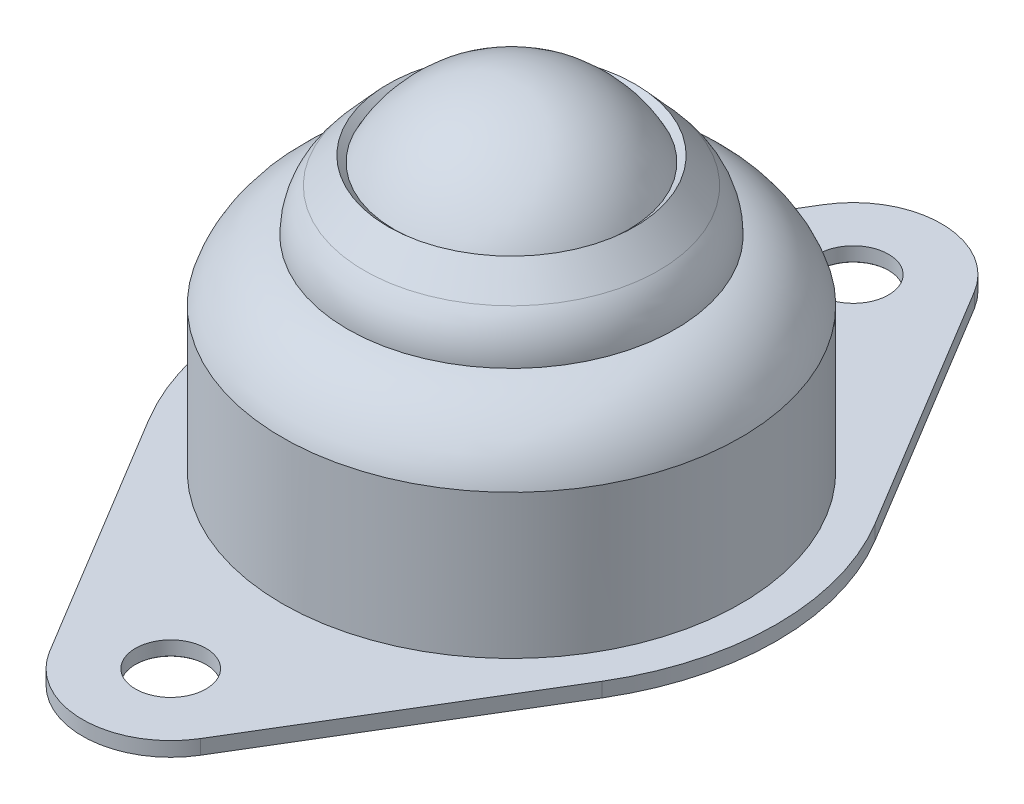
ISO-10303-21;
HEADER;
FILE_DESCRIPTION(('STEP AP214'),'2;1');
FILE_NAME('part.step','',(''),(''),'','','');
FILE_SCHEMA(('AUTOMOTIVE_DESIGN { 1 0 10303 214 1 1 1 1 }'));
ENDSEC;
DATA;
#1=APPLICATION_CONTEXT('core data for automotive mechanical design processes');
#2=APPLICATION_PROTOCOL_DEFINITION('international standard','automotive_design',2000,#1);
#3=PRODUCT_CONTEXT('',#1,'mechanical');
#4=PRODUCT('Part','Part','',(#3));
#5=PRODUCT_RELATED_PRODUCT_CATEGORY('part','',(#4));
#6=PRODUCT_DEFINITION_FORMATION('','',#4);
#7=PRODUCT_DEFINITION_CONTEXT('part definition',#1,'design');
#8=PRODUCT_DEFINITION('design','',#6,#7);
#9=PRODUCT_DEFINITION_SHAPE('','',#8);
#10=(LENGTH_UNIT() NAMED_UNIT(*) SI_UNIT(.MILLI.,.METRE.));
#11=(NAMED_UNIT(*) PLANE_ANGLE_UNIT() SI_UNIT($,.RADIAN.));
#12=(NAMED_UNIT(*) SI_UNIT($,.STERADIAN.) SOLID_ANGLE_UNIT());
#13=UNCERTAINTY_MEASURE_WITH_UNIT(LENGTH_MEASURE(1.E-05),#10,'distance_accuracy_value','');
#14=(GEOMETRIC_REPRESENTATION_CONTEXT(3) GLOBAL_UNCERTAINTY_ASSIGNED_CONTEXT((#13)) GLOBAL_UNIT_ASSIGNED_CONTEXT((#10,
#11,#12)) REPRESENTATION_CONTEXT('',''));
#15=CARTESIAN_POINT('',(0.,0.,0.));
#16=DIRECTION('',(0.,0.,1.));
#17=DIRECTION('',(1.,0.,0.));
#18=AXIS2_PLACEMENT_3D('',#15,#16,#17);
#19=CARTESIAN_POINT('',(0.,12.5,0.));
#20=DIRECTION('',(0.,-1.,0.));
#21=DIRECTION('',(0.,0.,1.));
#22=AXIS2_PLACEMENT_3D('',#19,#20,#21);
#23=SPHERICAL_SURFACE('',#22,7.5);
#24=CARTESIAN_POINT('',(0.,5.,0.));
#25=VERTEX_POINT('',#24);
#26=VERTEX_LOOP('',#25);
#27=FACE_BOUND('',#26,.T.);
#28=ADVANCED_FACE('F44',(#27),#23,.T.);
#29=CLOSED_SHELL('',(#28));
#30=MANIFOLD_SOLID_BREP('B2',#29);
#31=CARTESIAN_POINT('',(0.0289951469684916,0.,-19.35));
#32=DIRECTION('',(0.,1.,0.));
#33=DIRECTION('',(0.,0.,1.));
#34=AXIS2_PLACEMENT_3D('',#31,#32,#33);
#35=PLANE('',#34);
#36=CARTESIAN_POINT('',(0.0289951469684916,0.,-19.35));
#37=DIRECTION('',(0.,-1.,0.));
#38=DIRECTION('',(0.,0.,-1.));
#39=AXIS2_PLACEMENT_3D('',#36,#37,#38);
#40=CIRCLE('',#39,2.025);
#41=CARTESIAN_POINT('',(0.0289951469684916,0.,-21.375));
#42=VERTEX_POINT('',#41);
#43=EDGE_CURVE('E215',#42,#42,#40,.T.);
#44=ORIENTED_EDGE('',*,*,#43,.F.);
#45=EDGE_LOOP('',(#44));
#46=FACE_BOUND('',#45,.T.);
#47=CARTESIAN_POINT('',(0.0289951469684916,0.,-19.35));
#48=DIRECTION('',(0.,1.,0.));
#49=DIRECTION('',(0.,0.,1.));
#50=AXIS2_PLACEMENT_3D('',#47,#48,#49);
#51=CIRCLE('',#50,5.);
#52=CARTESIAN_POINT('',(4.30953843393734,0.,-21.9339793281654));
#53=VERTEX_POINT('',#52);
#54=CARTESIAN_POINT('',(-4.25154814000035,0.,-21.9339793281654));
#55=VERTEX_POINT('',#54);
#56=EDGE_CURVE('E156',#53,#55,#51,.T.);
#57=ORIENTED_EDGE('',*,*,#56,.F.);
#58=DIRECTION('',(-0.516795865633075,0.,-0.856108657393769));
#59=VECTOR('',#58,1.);
#60=CARTESIAN_POINT('',(4.30953843393734,0.,-21.9339793281654));
#61=LINE('',#60,#59);
#62=CARTESIAN_POINT('',(12.870625007875,0.,-7.75193798449612));
#63=VERTEX_POINT('',#62);
#64=EDGE_CURVE('E109',#63,#53,#61,.T.);
#65=ORIENTED_EDGE('',*,*,#64,.F.);
#66=CARTESIAN_POINT('',(0.0289951469684916,0.,0.));
#67=DIRECTION('',(0.,1.,0.));
#68=DIRECTION('',(0.,0.,1.));
#69=AXIS2_PLACEMENT_3D('',#66,#67,#68);
#70=CIRCLE('',#69,15.);
#71=CARTESIAN_POINT('',(12.870625007875,0.,7.75193798449612));
#72=VERTEX_POINT('',#71);
#73=EDGE_CURVE('E104',#72,#63,#70,.T.);
#74=ORIENTED_EDGE('',*,*,#73,.F.);
#75=DIRECTION('',(0.516795865633075,0.,-0.856108657393769));
#76=VECTOR('',#75,1.);
#77=CARTESIAN_POINT('',(4.30953843393734,0.,21.9339793281654));
#78=LINE('',#77,#76);
#79=CARTESIAN_POINT('',(4.30953843393734,0.,21.9339793281654));
#80=VERTEX_POINT('',#79);
#81=EDGE_CURVE('E149',#80,#72,#78,.T.);
#82=ORIENTED_EDGE('',*,*,#81,.F.);
#83=CARTESIAN_POINT('',(0.0289951469684916,0.,19.35));
#84=DIRECTION('',(0.,1.,0.));
#85=DIRECTION('',(0.,0.,-1.));
#86=AXIS2_PLACEMENT_3D('',#83,#84,#85);
#87=CIRCLE('',#86,5.);
#88=CARTESIAN_POINT('',(-4.25154814000035,0.,21.9339793281654));
#89=VERTEX_POINT('',#88);
#90=EDGE_CURVE('E168',#89,#80,#87,.T.);
#91=ORIENTED_EDGE('',*,*,#90,.F.);
#92=DIRECTION('',(0.516795865633075,0.,0.856108657393769));
#93=VECTOR('',#92,1.);
#94=CARTESIAN_POINT('',(-4.25154814000035,0.,21.9339793281654));
#95=LINE('',#94,#93);
#96=CARTESIAN_POINT('',(-12.812634713938,0.,7.75193798449612));
#97=VERTEX_POINT('',#96);
#98=EDGE_CURVE('E165',#97,#89,#95,.T.);
#99=ORIENTED_EDGE('',*,*,#98,.F.);
#100=CARTESIAN_POINT('',(0.0289951469684916,0.,0.));
#101=DIRECTION('',(0.,1.,0.));
#102=DIRECTION('',(0.,0.,1.));
#103=AXIS2_PLACEMENT_3D('',#100,#101,#102);
#104=CIRCLE('',#103,15.);
#105=CARTESIAN_POINT('',(-12.812634713938,0.,-7.75193798449612));
#106=VERTEX_POINT('',#105);
#107=EDGE_CURVE('E162',#106,#97,#104,.T.);
#108=ORIENTED_EDGE('',*,*,#107,.F.);
#109=DIRECTION('',(-0.516795865633075,0.,0.856108657393769));
#110=VECTOR('',#109,1.);
#111=CARTESIAN_POINT('',(-4.25154814000035,0.,-21.9339793281654));
#112=LINE('',#111,#110);
#113=EDGE_CURVE('E158',#55,#106,#112,.T.);
#114=ORIENTED_EDGE('',*,*,#113,.F.);
#115=EDGE_LOOP('',(#57,#65,#74,#82,#91,#99,#108,#114));
#116=FACE_BOUND('',#115,.T.);
#117=CARTESIAN_POINT('',(0.0289951469684916,0.,19.35));
#118=DIRECTION('',(0.,-1.,0.));
#119=DIRECTION('',(0.,0.,-1.));
#120=AXIS2_PLACEMENT_3D('',#117,#118,#119);
#121=CIRCLE('',#120,2.025);
#122=CARTESIAN_POINT('',(0.0289951469684916,0.,17.325));
#123=VERTEX_POINT('',#122);
#124=EDGE_CURVE('E222',#123,#123,#121,.T.);
#125=ORIENTED_EDGE('',*,*,#124,.F.);
#126=EDGE_LOOP('',(#125));
#127=FACE_BOUND('',#126,.T.);
#128=ADVANCED_FACE('F59',(#46,#116,#127),#35,.F.);
#129=CARTESIAN_POINT('',(0.0289951469684916,0.82,-19.35));
#130=DIRECTION('',(0.,-1.,0.));
#131=DIRECTION('',(0.,0.,-1.));
#132=AXIS2_PLACEMENT_3D('',#129,#130,#131);
#133=CYLINDRICAL_SURFACE('',#132,5.);
#134=ORIENTED_EDGE('',*,*,#56,.T.);
#135=DIRECTION('',(0.,-1.,0.));
#136=VECTOR('',#135,1.);
#137=CARTESIAN_POINT('',(-4.25154814000035,0.82,-21.9339793281654));
#138=LINE('',#137,#136);
#139=CARTESIAN_POINT('',(-4.25154814000035,0.82,-21.9339793281654));
#140=VERTEX_POINT('',#139);
#141=EDGE_CURVE('E69',#140,#55,#138,.T.);
#142=ORIENTED_EDGE('',*,*,#141,.F.);
#143=CARTESIAN_POINT('',(0.0289951469684916,0.82,-19.35));
#144=DIRECTION('',(0.,1.,0.));
#145=DIRECTION('',(0.,0.,1.));
#146=AXIS2_PLACEMENT_3D('',#143,#144,#145);
#147=CIRCLE('',#146,5.);
#148=CARTESIAN_POINT('',(4.30953843393734,0.82,-21.9339793281654));
#149=VERTEX_POINT('',#148);
#150=EDGE_CURVE('E171',#149,#140,#147,.T.);
#151=ORIENTED_EDGE('',*,*,#150,.F.);
#152=DIRECTION('',(0.,-1.,0.));
#153=VECTOR('',#152,1.);
#154=CARTESIAN_POINT('',(4.30953843393734,0.82,-21.9339793281654));
#155=LINE('',#154,#153);
#156=EDGE_CURVE('E154',#149,#53,#155,.T.);
#157=ORIENTED_EDGE('',*,*,#156,.T.);
#158=EDGE_LOOP('',(#134,#142,#151,#157));
#159=FACE_BOUND('',#158,.T.);
#160=ADVANCED_FACE('F58',(#159),#133,.T.);
#161=CARTESIAN_POINT('',(-4.25154814000035,0.82,-21.9339793281654));
#162=DIRECTION('',(0.856108657393769,0.,0.516795865633075));
#163=DIRECTION('',(0.516795865633075,0.,-0.856108657393769));
#164=AXIS2_PLACEMENT_3D('',#161,#162,#163);
#165=PLANE('',#164);
#166=ORIENTED_EDGE('',*,*,#113,.T.);
#167=DIRECTION('',(0.,-1.,0.));
#168=VECTOR('',#167,1.);
#169=CARTESIAN_POINT('',(-12.812634713938,0.82,-7.75193798449612));
#170=LINE('',#169,#168);
#171=CARTESIAN_POINT('',(-12.812634713938,0.82,-7.75193798449612));
#172=VERTEX_POINT('',#171);
#173=EDGE_CURVE('E181',#172,#106,#170,.T.);
#174=ORIENTED_EDGE('',*,*,#173,.F.);
#175=DIRECTION('',(-0.516795865633075,0.,0.856108657393769));
#176=VECTOR('',#175,1.);
#177=CARTESIAN_POINT('',(-4.25154814000035,0.82,-21.9339793281654));
#178=LINE('',#177,#176);
#179=EDGE_CURVE('E118',#140,#172,#178,.T.);
#180=ORIENTED_EDGE('',*,*,#179,.F.);
#181=ORIENTED_EDGE('',*,*,#141,.T.);
#182=EDGE_LOOP('',(#166,#174,#180,#181));
#183=FACE_BOUND('',#182,.T.);
#184=ADVANCED_FACE('F183',(#183),#165,.F.);
#185=CARTESIAN_POINT('',(0.0289951469684916,0.82,0.));
#186=DIRECTION('',(0.,-1.,0.));
#187=DIRECTION('',(0.,0.,-1.));
#188=AXIS2_PLACEMENT_3D('',#185,#186,#187);
#189=CYLINDRICAL_SURFACE('',#188,15.);
#190=ORIENTED_EDGE('',*,*,#107,.T.);
#191=DIRECTION('',(0.,-1.,0.));
#192=VECTOR('',#191,1.);
#193=CARTESIAN_POINT('',(-12.812634713938,0.82,7.75193798449612));
#194=LINE('',#193,#192);
#195=CARTESIAN_POINT('',(-12.812634713938,0.82,7.75193798449612));
#196=VERTEX_POINT('',#195);
#197=EDGE_CURVE('E178',#196,#97,#194,.T.);
#198=ORIENTED_EDGE('',*,*,#197,.F.);
#199=CARTESIAN_POINT('',(0.0289951469684916,0.82,0.));
#200=DIRECTION('',(0.,1.,0.));
#201=DIRECTION('',(0.,0.,1.));
#202=AXIS2_PLACEMENT_3D('',#199,#200,#201);
#203=CIRCLE('',#202,15.);
#204=EDGE_CURVE('E202',#172,#196,#203,.T.);
#205=ORIENTED_EDGE('',*,*,#204,.F.);
#206=ORIENTED_EDGE('',*,*,#173,.T.);
#207=EDGE_LOOP('',(#190,#198,#205,#206));
#208=FACE_BOUND('',#207,.T.);
#209=ADVANCED_FACE('F192',(#208),#189,.T.);
#210=CARTESIAN_POINT('',(-4.25154814000035,0.82,21.9339793281654));
#211=DIRECTION('',(0.856108657393769,0.,-0.516795865633075));
#212=DIRECTION('',(-0.516795865633075,0.,-0.856108657393769));
#213=AXIS2_PLACEMENT_3D('',#210,#211,#212);
#214=PLANE('',#213);
#215=ORIENTED_EDGE('',*,*,#98,.T.);
#216=DIRECTION('',(0.,-1.,0.));
#217=VECTOR('',#216,1.);
#218=CARTESIAN_POINT('',(-4.25154814000035,0.82,21.9339793281654));
#219=LINE('',#218,#217);
#220=CARTESIAN_POINT('',(-4.25154814000035,0.82,21.9339793281654));
#221=VERTEX_POINT('',#220);
#222=EDGE_CURVE('E174',#221,#89,#219,.T.);
#223=ORIENTED_EDGE('',*,*,#222,.F.);
#224=DIRECTION('',(0.516795865633075,0.,0.856108657393769));
#225=VECTOR('',#224,1.);
#226=CARTESIAN_POINT('',(-4.25154814000035,0.82,21.9339793281654));
#227=LINE('',#226,#225);
#228=EDGE_CURVE('E201',#196,#221,#227,.T.);
#229=ORIENTED_EDGE('',*,*,#228,.F.);
#230=ORIENTED_EDGE('',*,*,#197,.T.);
#231=EDGE_LOOP('',(#215,#223,#229,#230));
#232=FACE_BOUND('',#231,.T.);
#233=ADVANCED_FACE('F200',(#232),#214,.F.);
#234=CARTESIAN_POINT('',(0.0289951469684916,0.82,19.35));
#235=DIRECTION('',(0.,-1.,0.));
#236=DIRECTION('',(0.,0.,-1.));
#237=AXIS2_PLACEMENT_3D('',#234,#235,#236);
#238=CYLINDRICAL_SURFACE('',#237,5.);
#239=ORIENTED_EDGE('',*,*,#90,.T.);
#240=DIRECTION('',(0.,-1.,0.));
#241=VECTOR('',#240,1.);
#242=CARTESIAN_POINT('',(4.30953843393734,0.82,21.9339793281654));
#243=LINE('',#242,#241);
#244=CARTESIAN_POINT('',(4.30953843393734,0.82,21.9339793281654));
#245=VERTEX_POINT('',#244);
#246=EDGE_CURVE('E146',#245,#80,#243,.T.);
#247=ORIENTED_EDGE('',*,*,#246,.F.);
#248=CARTESIAN_POINT('',(0.0289951469684916,0.82,19.35));
#249=DIRECTION('',(0.,1.,0.));
#250=DIRECTION('',(0.,0.,-1.));
#251=AXIS2_PLACEMENT_3D('',#248,#249,#250);
#252=CIRCLE('',#251,5.);
#253=EDGE_CURVE('E139',#221,#245,#252,.T.);
#254=ORIENTED_EDGE('',*,*,#253,.F.);
#255=ORIENTED_EDGE('',*,*,#222,.T.);
#256=EDGE_LOOP('',(#239,#247,#254,#255));
#257=FACE_BOUND('',#256,.T.);
#258=ADVANCED_FACE('F293',(#257),#238,.T.);
#259=CARTESIAN_POINT('',(4.30953843393734,0.82,21.9339793281654));
#260=DIRECTION('',(-0.856108657393769,0.,-0.516795865633075));
#261=DIRECTION('',(-0.516795865633075,0.,0.856108657393769));
#262=AXIS2_PLACEMENT_3D('',#259,#260,#261);
#263=PLANE('',#262);
#264=ORIENTED_EDGE('',*,*,#81,.T.);
#265=DIRECTION('',(0.,-1.,0.));
#266=VECTOR('',#265,1.);
#267=CARTESIAN_POINT('',(12.870625007875,0.82,7.75193798449612));
#268=LINE('',#267,#266);
#269=CARTESIAN_POINT('',(12.870625007875,0.82,7.75193798449612));
#270=VERTEX_POINT('',#269);
#271=EDGE_CURVE('E141',#270,#72,#268,.T.);
#272=ORIENTED_EDGE('',*,*,#271,.F.);
#273=DIRECTION('',(0.516795865633075,0.,-0.856108657393769));
#274=VECTOR('',#273,1.);
#275=CARTESIAN_POINT('',(4.30953843393734,0.82,21.9339793281654));
#276=LINE('',#275,#274);
#277=EDGE_CURVE('E134',#245,#270,#276,.T.);
#278=ORIENTED_EDGE('',*,*,#277,.F.);
#279=ORIENTED_EDGE('',*,*,#246,.T.);
#280=EDGE_LOOP('',(#264,#272,#278,#279));
#281=FACE_BOUND('',#280,.T.);
#282=ADVANCED_FACE('F144',(#281),#263,.F.);
#283=CARTESIAN_POINT('',(0.0289951469684916,0.82,0.));
#284=DIRECTION('',(0.,-1.,0.));
#285=DIRECTION('',(0.,0.,-1.));
#286=AXIS2_PLACEMENT_3D('',#283,#284,#285);
#287=CYLINDRICAL_SURFACE('',#286,15.);
#288=ORIENTED_EDGE('',*,*,#73,.T.);
#289=DIRECTION('',(0.,-1.,0.));
#290=VECTOR('',#289,1.);
#291=CARTESIAN_POINT('',(12.870625007875,0.82,-7.75193798449612));
#292=LINE('',#291,#290);
#293=CARTESIAN_POINT('',(12.870625007875,0.82,-7.75193798449612));
#294=VERTEX_POINT('',#293);
#295=EDGE_CURVE('E150',#294,#63,#292,.T.);
#296=ORIENTED_EDGE('',*,*,#295,.F.);
#297=CARTESIAN_POINT('',(0.0289951469684916,0.82,0.));
#298=DIRECTION('',(0.,1.,0.));
#299=DIRECTION('',(0.,0.,1.));
#300=AXIS2_PLACEMENT_3D('',#297,#298,#299);
#301=CIRCLE('',#300,15.);
#302=EDGE_CURVE('E136',#270,#294,#301,.T.);
#303=ORIENTED_EDGE('',*,*,#302,.F.);
#304=ORIENTED_EDGE('',*,*,#271,.T.);
#305=EDGE_LOOP('',(#288,#296,#303,#304));
#306=FACE_BOUND('',#305,.T.);
#307=ADVANCED_FACE('F147',(#306),#287,.T.);
#308=CARTESIAN_POINT('',(4.30953843393734,0.82,-21.9339793281654));
#309=DIRECTION('',(-0.856108657393769,0.,0.516795865633075));
#310=DIRECTION('',(0.516795865633075,0.,0.856108657393769));
#311=AXIS2_PLACEMENT_3D('',#308,#309,#310);
#312=PLANE('',#311);
#313=ORIENTED_EDGE('',*,*,#64,.T.);
#314=ORIENTED_EDGE('',*,*,#156,.F.);
#315=DIRECTION('',(-0.516795865633075,0.,-0.856108657393769));
#316=VECTOR('',#315,1.);
#317=CARTESIAN_POINT('',(4.30953843393734,0.82,-21.9339793281654));
#318=LINE('',#317,#316);
#319=EDGE_CURVE('E75',#294,#149,#318,.T.);
#320=ORIENTED_EDGE('',*,*,#319,.F.);
#321=ORIENTED_EDGE('',*,*,#295,.T.);
#322=EDGE_LOOP('',(#313,#314,#320,#321));
#323=FACE_BOUND('',#322,.T.);
#324=ADVANCED_FACE('F281',(#323),#312,.F.);
#325=CARTESIAN_POINT('',(0.0289951469684916,0.82,-19.35));
#326=DIRECTION('',(0.,1.,0.));
#327=DIRECTION('',(0.,0.,1.));
#328=AXIS2_PLACEMENT_3D('',#325,#326,#327);
#329=PLANE('',#328);
#330=CARTESIAN_POINT('',(0.,0.82,0.));
#331=DIRECTION('',(0.,1.,0.));
#332=DIRECTION('',(0.,0.,1.));
#333=AXIS2_PLACEMENT_3D('',#330,#331,#332);
#334=CIRCLE('',#333,13.);
#335=CARTESIAN_POINT('',(0.,0.82,13.));
#336=VERTEX_POINT('',#335);
#337=EDGE_CURVE('E43',#336,#336,#334,.T.);
#338=ORIENTED_EDGE('',*,*,#337,.F.);
#339=EDGE_LOOP('',(#338));
#340=FACE_BOUND('',#339,.T.);
#341=CARTESIAN_POINT('',(0.0289951469684916,0.82,19.35));
#342=DIRECTION('',(0.,-1.,0.));
#343=DIRECTION('',(0.,0.,-1.));
#344=AXIS2_PLACEMENT_3D('',#341,#342,#343);
#345=CIRCLE('',#344,2.);
#346=CARTESIAN_POINT('',(0.0289951469684916,0.82,17.35));
#347=VERTEX_POINT('',#346);
#348=EDGE_CURVE('E218',#347,#347,#345,.T.);
#349=ORIENTED_EDGE('',*,*,#348,.T.);
#350=EDGE_LOOP('',(#349));
#351=FACE_BOUND('',#350,.T.);
#352=CARTESIAN_POINT('',(0.0289951469684916,0.82,-19.35));
#353=DIRECTION('',(0.,-1.,0.));
#354=DIRECTION('',(0.,0.,-1.));
#355=AXIS2_PLACEMENT_3D('',#352,#353,#354);
#356=CIRCLE('',#355,2.);
#357=CARTESIAN_POINT('',(0.0289951469684916,0.82,-21.35));
#358=VERTEX_POINT('',#357);
#359=EDGE_CURVE('E160',#358,#358,#356,.T.);
#360=ORIENTED_EDGE('',*,*,#359,.T.);
#361=EDGE_LOOP('',(#360));
#362=FACE_BOUND('',#361,.T.);
#363=ORIENTED_EDGE('',*,*,#150,.T.);
#364=ORIENTED_EDGE('',*,*,#179,.T.);
#365=ORIENTED_EDGE('',*,*,#204,.T.);
#366=ORIENTED_EDGE('',*,*,#228,.T.);
#367=ORIENTED_EDGE('',*,*,#253,.T.);
#368=ORIENTED_EDGE('',*,*,#277,.T.);
#369=ORIENTED_EDGE('',*,*,#302,.T.);
#370=ORIENTED_EDGE('',*,*,#319,.T.);
#371=EDGE_LOOP('',(#363,#364,#365,#366,#367,#368,#369,#370));
#372=FACE_BOUND('',#371,.T.);
#373=ADVANCED_FACE('F135',(#340,#351,#362,#372),#329,.T.);
#374=CARTESIAN_POINT('',(0.0289951469684916,0.,-19.35));
#375=DIRECTION('',(0.,-1.,0.));
#376=DIRECTION('',(0.,0.,-1.));
#377=AXIS2_PLACEMENT_3D('',#374,#375,#376);
#378=CYLINDRICAL_SURFACE('',#377,2.);
#379=ORIENTED_EDGE('',*,*,#359,.F.);
#380=EDGE_LOOP('',(#379));
#381=FACE_BOUND('',#380,.T.);
#382=CARTESIAN_POINT('',(0.0289951469684916,0.0250000000000012,-19.35));
#383=DIRECTION('',(0.,-1.,0.));
#384=DIRECTION('',(0.,0.,-1.));
#385=AXIS2_PLACEMENT_3D('',#382,#383,#384);
#386=CIRCLE('',#385,2.);
#387=CARTESIAN_POINT('',(0.0289951469684916,0.0250000000000012,-21.35));
#388=VERTEX_POINT('',#387);
#389=EDGE_CURVE('E208',#388,#388,#386,.T.);
#390=ORIENTED_EDGE('',*,*,#389,.T.);
#391=EDGE_LOOP('',(#390));
#392=FACE_BOUND('',#391,.T.);
#393=ADVANCED_FACE('F341',(#381,#392),#378,.F.);
#394=CARTESIAN_POINT('',(0.0289951469684916,0.,-19.35));
#395=DIRECTION('',(0.,-1.,0.));
#396=DIRECTION('',(0.,0.,-1.));
#397=AXIS2_PLACEMENT_3D('',#394,#395,#396);
#398=CONICAL_SURFACE('',#397,2.025,0.785398163397369);
#399=ORIENTED_EDGE('',*,*,#389,.F.);
#400=EDGE_LOOP('',(#399));
#401=FACE_BOUND('',#400,.T.);
#402=ORIENTED_EDGE('',*,*,#43,.T.);
#403=EDGE_LOOP('',(#402));
#404=FACE_BOUND('',#403,.T.);
#405=ADVANCED_FACE('F373',(#401,#404),#398,.F.);
#406=CARTESIAN_POINT('',(0.0289951469684916,0.,19.35));
#407=DIRECTION('',(0.,-1.,0.));
#408=DIRECTION('',(0.,0.,-1.));
#409=AXIS2_PLACEMENT_3D('',#406,#407,#408);
#410=CYLINDRICAL_SURFACE('',#409,2.);
#411=ORIENTED_EDGE('',*,*,#348,.F.);
#412=EDGE_LOOP('',(#411));
#413=FACE_BOUND('',#412,.T.);
#414=CARTESIAN_POINT('',(0.0289951469684916,0.0250000000000012,19.35));
#415=DIRECTION('',(0.,-1.,0.));
#416=DIRECTION('',(0.,0.,-1.));
#417=AXIS2_PLACEMENT_3D('',#414,#415,#416);
#418=CIRCLE('',#417,2.);
#419=CARTESIAN_POINT('',(0.0289951469684916,0.0250000000000012,17.35));
#420=VERTEX_POINT('',#419);
#421=EDGE_CURVE('E220',#420,#420,#418,.T.);
#422=ORIENTED_EDGE('',*,*,#421,.T.);
#423=EDGE_LOOP('',(#422));
#424=FACE_BOUND('',#423,.T.);
#425=ADVANCED_FACE('F270',(#413,#424),#410,.F.);
#426=CARTESIAN_POINT('',(0.0289951469684916,0.,19.35));
#427=DIRECTION('',(0.,-1.,0.));
#428=DIRECTION('',(0.,0.,-1.));
#429=AXIS2_PLACEMENT_3D('',#426,#427,#428);
#430=CONICAL_SURFACE('',#429,2.025,0.785398163397369);
#431=ORIENTED_EDGE('',*,*,#421,.F.);
#432=EDGE_LOOP('',(#431));
#433=FACE_BOUND('',#432,.T.);
#434=ORIENTED_EDGE('',*,*,#124,.T.);
#435=EDGE_LOOP('',(#434));
#436=FACE_BOUND('',#435,.T.);
#437=ADVANCED_FACE('F258',(#433,#436),#430,.F.);
#438=CARTESIAN_POINT('',(0.,14.8462377937708,0.));
#439=DIRECTION('',(0.,-1.,0.));
#440=DIRECTION('',(0.,0.,-1.));
#441=AXIS2_PLACEMENT_3D('',#438,#439,#440);
#442=CONICAL_SURFACE('',#441,8.34702705955384,0.733820215813012);
#443=CARTESIAN_POINT('',(0.,16.3348557444783,0.));
#444=DIRECTION('',(0.,-1.,0.));
#445=DIRECTION('',(0.,0.,-1.));
#446=AXIS2_PLACEMENT_3D('',#443,#444,#445);
#447=CIRCLE('',#446,7.0045602732445);
#448=CARTESIAN_POINT('',(0.,16.3348557444783,-7.0045602732445));
#449=VERTEX_POINT('',#448);
#450=EDGE_CURVE('E225',#449,#449,#447,.T.);
#451=ORIENTED_EDGE('',*,*,#450,.T.);
#452=EDGE_LOOP('',(#451));
#453=FACE_BOUND('',#452,.T.);
#454=CARTESIAN_POINT('',(0.,14.8462377937708,0.));
#455=DIRECTION('',(0.,-1.,0.));
#456=DIRECTION('',(0.,0.,-1.));
#457=AXIS2_PLACEMENT_3D('',#454,#455,#456);
#458=CIRCLE('',#457,8.34702705955384);
#459=CARTESIAN_POINT('',(0.,14.8462377937708,-8.34702705955384));
#460=VERTEX_POINT('',#459);
#461=EDGE_CURVE('E248',#460,#460,#458,.T.);
#462=ORIENTED_EDGE('',*,*,#461,.F.);
#463=EDGE_LOOP('',(#462));
#464=FACE_BOUND('',#463,.T.);
#465=ADVANCED_FACE('F259',(#453,#464),#442,.T.);
#466=CARTESIAN_POINT('',(0.,16.,0.));
#467=DIRECTION('',(0.,1.,0.));
#468=DIRECTION('',(0.,0.,1.));
#469=AXIS2_PLACEMENT_3D('',#466,#467,#468);
#470=CONICAL_SURFACE('',#469,6.6332495807108,0.836976110981882);
#471=ORIENTED_EDGE('',*,*,#450,.F.);
#472=EDGE_LOOP('',(#471));
#473=FACE_BOUND('',#472,.T.);
#474=CARTESIAN_POINT('',(0.,16.,0.));
#475=DIRECTION('',(0.,-1.,0.));
#476=DIRECTION('',(0.,0.,-1.));
#477=AXIS2_PLACEMENT_3D('',#474,#475,#476);
#478=CIRCLE('',#477,6.6332495807108);
#479=CARTESIAN_POINT('',(0.,16.,-6.6332495807108));
#480=VERTEX_POINT('',#479);
#481=EDGE_CURVE('E226',#480,#480,#478,.T.);
#482=ORIENTED_EDGE('',*,*,#481,.T.);
#483=EDGE_LOOP('',(#482));
#484=FACE_BOUND('',#483,.T.);
#485=ADVANCED_FACE('F260',(#473,#484),#470,.F.);
#486=CARTESIAN_POINT('',(0.,14.5113820492924,0.));
#487=DIRECTION('',(0.,-1.,0.));
#488=DIRECTION('',(0.,0.,-1.));
#489=AXIS2_PLACEMENT_3D('',#486,#487,#488);
#490=CONICAL_SURFACE('',#489,7.97571636702014,0.733820215813013);
#491=ORIENTED_EDGE('',*,*,#481,.F.);
#492=EDGE_LOOP('',(#491));
#493=FACE_BOUND('',#492,.T.);
#494=CARTESIAN_POINT('',(0.,14.5113820492924,0.));
#495=DIRECTION('',(0.,-1.,0.));
#496=DIRECTION('',(0.,0.,-1.));
#497=AXIS2_PLACEMENT_3D('',#494,#495,#496);
#498=CIRCLE('',#497,7.97571636702014);
#499=CARTESIAN_POINT('',(0.,14.5113820492924,-7.97571636702014));
#500=VERTEX_POINT('',#499);
#501=EDGE_CURVE('E233',#500,#500,#498,.T.);
#502=ORIENTED_EDGE('',*,*,#501,.T.);
#503=EDGE_LOOP('',(#502));
#504=FACE_BOUND('',#503,.T.);
#505=ADVANCED_FACE('F266',(#493,#504),#490,.F.);
#506=CARTESIAN_POINT('',(0.,12.3865938182009,0.));
#507=DIRECTION('',(0.,-1.,0.));
#508=DIRECTION('',(0.,0.,-1.));
#509=AXIS2_PLACEMENT_3D('',#506,#507,#508);
#510=TOROIDAL_SURFACE('',#509,5.61960749750341,3.17269192201203);
#511=ORIENTED_EDGE('',*,*,#501,.F.);
#512=EDGE_LOOP('',(#511));
#513=FACE_BOUND('',#512,.T.);
#514=CARTESIAN_POINT('',(0.,12.0316158282351,0.));
#515=DIRECTION('',(0.,-1.,0.));
#516=DIRECTION('',(0.,0.,-1.));
#517=AXIS2_PLACEMENT_3D('',#514,#515,#516);
#518=CIRCLE('',#517,8.772378446786);
#519=CARTESIAN_POINT('',(0.,12.0316158282351,-8.772378446786));
#520=VERTEX_POINT('',#519);
#521=EDGE_CURVE('E234',#520,#520,#518,.T.);
#522=ORIENTED_EDGE('',*,*,#521,.T.);
#523=EDGE_LOOP('',(#522));
#524=FACE_BOUND('',#523,.T.);
#525=ADVANCED_FACE('F432',(#513,#524),#510,.F.);
#526=CARTESIAN_POINT('',(0.,7.44472728091486,0.));
#527=DIRECTION('',(0.,-1.,0.));
#528=DIRECTION('',(0.,0.,-1.));
#529=AXIS2_PLACEMENT_3D('',#526,#527,#528);
#530=TOROIDAL_SURFACE('',#529,8.09790316766026,4.63621218751789);
#531=ORIENTED_EDGE('',*,*,#521,.F.);
#532=EDGE_LOOP('',(#531));
#533=FACE_BOUND('',#532,.T.);
#534=CARTESIAN_POINT('',(0.,8.89937738537086,0.));
#535=DIRECTION('',(0.,-1.,0.));
#536=DIRECTION('',(0.,0.,-1.));
#537=AXIS2_PLACEMENT_3D('',#534,#535,#536);
#538=CIRCLE('',#537,12.5);
#539=CARTESIAN_POINT('',(0.,8.89937738537086,-12.5));
#540=VERTEX_POINT('',#539);
#541=EDGE_CURVE('E240',#540,#540,#538,.T.);
#542=ORIENTED_EDGE('',*,*,#541,.T.);
#543=EDGE_LOOP('',(#542));
#544=FACE_BOUND('',#543,.T.);
#545=ADVANCED_FACE('F443',(#533,#544),#530,.F.);
#546=CARTESIAN_POINT('',(0.,0.,0.));
#547=DIRECTION('',(0.,-1.,0.));
#548=DIRECTION('',(0.,0.,-1.));
#549=AXIS2_PLACEMENT_3D('',#546,#547,#548);
#550=CYLINDRICAL_SURFACE('',#549,12.5);
#551=ORIENTED_EDGE('',*,*,#541,.F.);
#552=EDGE_LOOP('',(#551));
#553=FACE_BOUND('',#552,.T.);
#554=CARTESIAN_POINT('',(0.,0.82,0.));
#555=DIRECTION('',(0.,-1.,0.));
#556=DIRECTION('',(0.,0.,-1.));
#557=AXIS2_PLACEMENT_3D('',#554,#555,#556);
#558=CIRCLE('',#557,12.5);
#559=CARTESIAN_POINT('',(0.,0.82,-12.5));
#560=VERTEX_POINT('',#559);
#561=EDGE_CURVE('E239',#560,#560,#558,.T.);
#562=ORIENTED_EDGE('',*,*,#561,.T.);
#563=EDGE_LOOP('',(#562));
#564=FACE_BOUND('',#563,.T.);
#565=ADVANCED_FACE('F453',(#553,#564),#550,.F.);
#566=CARTESIAN_POINT('',(0.,0.,0.));
#567=DIRECTION('',(0.,-1.,0.));
#568=DIRECTION('',(0.,0.,-1.));
#569=AXIS2_PLACEMENT_3D('',#566,#567,#568);
#570=CYLINDRICAL_SURFACE('',#569,13.);
#571=CARTESIAN_POINT('',(0.,8.97773813592275,0.));
#572=DIRECTION('',(0.,-1.,0.));
#573=DIRECTION('',(0.,0.,-1.));
#574=AXIS2_PLACEMENT_3D('',#571,#572,#573);
#575=CIRCLE('',#574,13.);
#576=CARTESIAN_POINT('',(0.,8.97773813592275,-13.));
#577=VERTEX_POINT('',#576);
#578=EDGE_CURVE('E243',#577,#577,#575,.T.);
#579=ORIENTED_EDGE('',*,*,#578,.T.);
#580=EDGE_LOOP('',(#579));
#581=FACE_BOUND('',#580,.T.);
#582=ORIENTED_EDGE('',*,*,#337,.T.);
#583=EDGE_LOOP('',(#582));
#584=FACE_BOUND('',#583,.T.);
#585=ADVANCED_FACE('F463',(#581,#584),#570,.T.);
#586=CARTESIAN_POINT('',(0.,7.44472728091486,0.));
#587=DIRECTION('',(0.,-1.,0.));
#588=DIRECTION('',(0.,0.,-1.));
#589=AXIS2_PLACEMENT_3D('',#586,#587,#588);
#590=TOROIDAL_SURFACE('',#589,8.09790316766026,5.13621218751789);
#591=CARTESIAN_POINT('',(0.,12.4402281203612,0.));
#592=DIRECTION('',(0.,-1.,0.));
#593=DIRECTION('',(0.,0.,-1.));
#594=AXIS2_PLACEMENT_3D('',#591,#592,#593);
#595=CIRCLE('',#594,9.29190777330388);
#596=CARTESIAN_POINT('',(0.,12.4402281203612,-9.29190777330388));
#597=VERTEX_POINT('',#596);
#598=EDGE_CURVE('E246',#597,#597,#595,.T.);
#599=ORIENTED_EDGE('',*,*,#598,.T.);
#600=EDGE_LOOP('',(#599));
#601=FACE_BOUND('',#600,.T.);
#602=ORIENTED_EDGE('',*,*,#578,.F.);
#603=EDGE_LOOP('',(#602));
#604=FACE_BOUND('',#603,.T.);
#605=ADVANCED_FACE('F473',(#601,#604),#590,.T.);
#606=CARTESIAN_POINT('',(0.,12.3865938182009,0.));
#607=DIRECTION('',(0.,-1.,0.));
#608=DIRECTION('',(0.,0.,-1.));
#609=AXIS2_PLACEMENT_3D('',#606,#607,#608);
#610=TOROIDAL_SURFACE('',#609,5.61960749750341,3.67269192201203);
#611=ORIENTED_EDGE('',*,*,#461,.T.);
#612=EDGE_LOOP('',(#611));
#613=FACE_BOUND('',#612,.T.);
#614=ORIENTED_EDGE('',*,*,#598,.F.);
#615=EDGE_LOOP('',(#614));
#616=FACE_BOUND('',#615,.T.);
#617=ADVANCED_FACE('F254',(#613,#616),#610,.T.);
#618=ORIENTED_EDGE('',*,*,#561,.F.);
#619=EDGE_LOOP('',(#618));
#620=FACE_BOUND('',#619,.T.);
#621=ADVANCED_FACE('F343',(#620),#329,.T.);
#622=CLOSED_SHELL('',(#128,#160,#184,#209,#233,#258,#282,#307,#324,#373,#393,#405,#425,#437,
#465,#485,#505,#525,#545,#565,#585,#605,#617,#621));
#623=MANIFOLD_SOLID_BREP('B6',#622);
#624=ADVANCED_BREP_SHAPE_REPRESENTATION('',(#18,#30,#623),#14);
#625=SHAPE_DEFINITION_REPRESENTATION(#9,#624);
ENDSEC;
END-ISO-10303-21;
